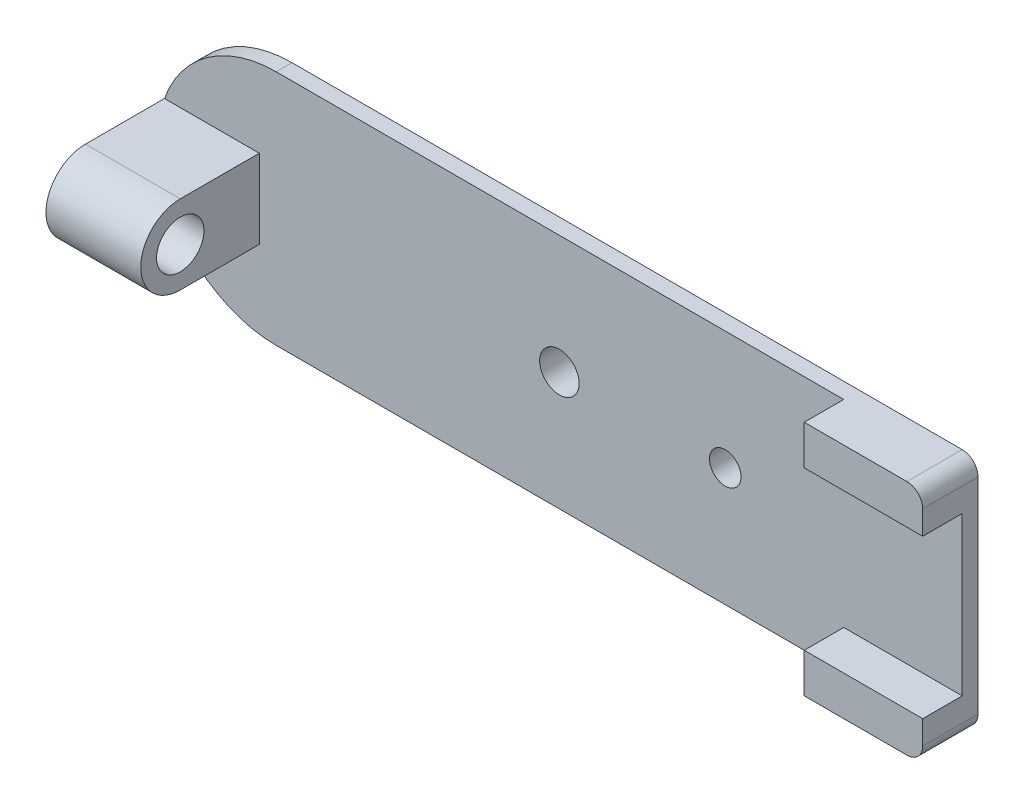
ISO-10303-21;
HEADER;
FILE_DESCRIPTION(('STEP AP214'),'2;1');
FILE_NAME('part.step','',(''),(''),'','','');
FILE_SCHEMA(('AUTOMOTIVE_DESIGN { 1 0 10303 214 1 1 1 1 }'));
ENDSEC;
DATA;
#1=APPLICATION_CONTEXT('core data for automotive mechanical design processes');
#2=APPLICATION_PROTOCOL_DEFINITION('international standard','automotive_design',2000,#1);
#3=PRODUCT_CONTEXT('',#1,'mechanical');
#4=PRODUCT('Part','Part','',(#3));
#5=PRODUCT_RELATED_PRODUCT_CATEGORY('part','',(#4));
#6=PRODUCT_DEFINITION_FORMATION('','',#4);
#7=PRODUCT_DEFINITION_CONTEXT('part definition',#1,'design');
#8=PRODUCT_DEFINITION('design','',#6,#7);
#9=PRODUCT_DEFINITION_SHAPE('','',#8);
#10=(LENGTH_UNIT() NAMED_UNIT(*) SI_UNIT(.MILLI.,.METRE.));
#11=(NAMED_UNIT(*) PLANE_ANGLE_UNIT() SI_UNIT($,.RADIAN.));
#12=(NAMED_UNIT(*) SI_UNIT($,.STERADIAN.) SOLID_ANGLE_UNIT());
#13=UNCERTAINTY_MEASURE_WITH_UNIT(LENGTH_MEASURE(1.E-05),#10,'distance_accuracy_value','');
#14=(GEOMETRIC_REPRESENTATION_CONTEXT(3) GLOBAL_UNCERTAINTY_ASSIGNED_CONTEXT((#13)) GLOBAL_UNIT_ASSIGNED_CONTEXT((#10,
#11,#12)) REPRESENTATION_CONTEXT('',''));
#15=CARTESIAN_POINT('',(0.,0.,0.));
#16=DIRECTION('',(0.,0.,1.));
#17=DIRECTION('',(1.,0.,0.));
#18=AXIS2_PLACEMENT_3D('',#15,#16,#17);
#19=CARTESIAN_POINT('',(0.,0.,0.));
#20=DIRECTION('',(0.,0.,1.));
#21=DIRECTION('',(1.,0.,0.));
#22=AXIS2_PLACEMENT_3D('',#19,#20,#21);
#23=PLANE('',#22);
#24=DIRECTION('',(0.,-1.,0.));
#25=VECTOR('',#24,1.);
#26=CARTESIAN_POINT('',(-28.2842712474619,10.,0.));
#27=LINE('',#26,#25);
#28=CARTESIAN_POINT('',(-28.2842712474619,10.,0.));
#29=VERTEX_POINT('',#28);
#30=CARTESIAN_POINT('',(-28.2842712474619,-9.99999999999999,0.));
#31=VERTEX_POINT('',#30);
#32=EDGE_CURVE('E334',#29,#31,#27,.T.);
#33=ORIENTED_EDGE('',*,*,#32,.F.);
#34=CARTESIAN_POINT('',(0.,0.,0.));
#35=DIRECTION('',(0.,0.,1.));
#36=DIRECTION('',(1.,0.,0.));
#37=AXIS2_PLACEMENT_3D('',#34,#35,#36);
#38=CIRCLE('',#37,30.);
#39=CARTESIAN_POINT('',(0.,30.,0.));
#40=VERTEX_POINT('',#39);
#41=EDGE_CURVE('E378',#40,#29,#38,.T.);
#42=ORIENTED_EDGE('',*,*,#41,.F.);
#43=DIRECTION('',(-1.,0.,0.));
#44=VECTOR('',#43,1.);
#45=CARTESIAN_POINT('',(0.,30.,0.));
#46=LINE('',#45,#44);
#47=CARTESIAN_POINT('',(169.715728752538,30.,0.));
#48=VERTEX_POINT('',#47);
#49=EDGE_CURVE('E332',#48,#40,#46,.T.);
#50=ORIENTED_EDGE('',*,*,#49,.F.);
#51=CARTESIAN_POINT('',(169.715728752538,26.,0.));
#52=DIRECTION('',(0.,0.,1.));
#53=DIRECTION('',(1.,0.,0.));
#54=AXIS2_PLACEMENT_3D('',#51,#52,#53);
#55=CIRCLE('',#54,4.);
#56=CARTESIAN_POINT('',(173.715728752538,26.,0.));
#57=VERTEX_POINT('',#56);
#58=EDGE_CURVE('E294',#48,#57,#55,.F.);
#59=ORIENTED_EDGE('',*,*,#58,.T.);
#60=DIRECTION('',(0.,1.,0.));
#61=VECTOR('',#60,1.);
#62=CARTESIAN_POINT('',(173.715728752538,30.,0.));
#63=LINE('',#62,#61);
#64=CARTESIAN_POINT('',(173.715728752538,-26.,0.));
#65=VERTEX_POINT('',#64);
#66=EDGE_CURVE('E325',#65,#57,#63,.T.);
#67=ORIENTED_EDGE('',*,*,#66,.F.);
#68=CARTESIAN_POINT('',(169.715728752538,-26.,0.));
#69=DIRECTION('',(0.,0.,1.));
#70=DIRECTION('',(1.,0.,0.));
#71=AXIS2_PLACEMENT_3D('',#68,#69,#70);
#72=CIRCLE('',#71,4.);
#73=CARTESIAN_POINT('',(169.715728752538,-30.,0.));
#74=VERTEX_POINT('',#73);
#75=EDGE_CURVE('E292',#65,#74,#72,.F.);
#76=ORIENTED_EDGE('',*,*,#75,.T.);
#77=DIRECTION('',(1.,0.,0.));
#78=VECTOR('',#77,1.);
#79=CARTESIAN_POINT('',(173.715728752538,-30.,0.));
#80=LINE('',#79,#78);
#81=CARTESIAN_POINT('',(0.,-30.,0.));
#82=VERTEX_POINT('',#81);
#83=EDGE_CURVE('E324',#82,#74,#80,.T.);
#84=ORIENTED_EDGE('',*,*,#83,.F.);
#85=CARTESIAN_POINT('',(0.,0.,0.));
#86=DIRECTION('',(0.,0.,1.));
#87=DIRECTION('',(1.,0.,0.));
#88=AXIS2_PLACEMENT_3D('',#85,#86,#87);
#89=CIRCLE('',#88,30.);
#90=EDGE_CURVE('E330',#31,#82,#89,.T.);
#91=ORIENTED_EDGE('',*,*,#90,.F.);
#92=EDGE_LOOP('',(#33,#42,#50,#59,#67,#76,#84,#91));
#93=FACE_BOUND('',#92,.T.);
#94=CARTESIAN_POINT('',(113.715728752538,0.,0.));
#95=DIRECTION('',(0.,0.,1.));
#96=DIRECTION('',(1.,0.,0.));
#97=AXIS2_PLACEMENT_3D('',#94,#95,#96);
#98=CIRCLE('',#97,10.);
#99=CARTESIAN_POINT('',(123.715728752538,0.,0.));
#100=VERTEX_POINT('',#99);
#101=EDGE_CURVE('E280',#100,#100,#98,.T.);
#102=ORIENTED_EDGE('',*,*,#101,.T.);
#103=EDGE_LOOP('',(#102));
#104=FACE_BOUND('',#103,.T.);
#105=CARTESIAN_POINT('',(71.7157287525381,0.,0.));
#106=DIRECTION('',(0.,0.,1.));
#107=DIRECTION('',(1.,0.,0.));
#108=AXIS2_PLACEMENT_3D('',#105,#106,#107);
#109=CIRCLE('',#108,11.);
#110=CARTESIAN_POINT('',(82.7157287525381,0.,0.));
#111=VERTEX_POINT('',#110);
#112=EDGE_CURVE('E276',#111,#111,#109,.T.);
#113=ORIENTED_EDGE('',*,*,#112,.T.);
#114=EDGE_LOOP('',(#113));
#115=FACE_BOUND('',#114,.T.);
#116=ADVANCED_FACE('F35',(#93,#104,#115),#23,.F.);
#117=CARTESIAN_POINT('',(0.,0.,4.));
#118=DIRECTION('',(0.,0.,1.));
#119=DIRECTION('',(1.,0.,0.));
#120=AXIS2_PLACEMENT_3D('',#117,#118,#119);
#121=PLANE('',#120);
#122=DIRECTION('',(-1.,0.,0.));
#123=VECTOR('',#122,1.);
#124=CARTESIAN_POINT('',(0.,10.,4.));
#125=LINE('',#124,#123);
#126=CARTESIAN_POINT('',(-4.2842712474619,10.,4.));
#127=VERTEX_POINT('',#126);
#128=CARTESIAN_POINT('',(-28.2842712474619,10.,4.));
#129=VERTEX_POINT('',#128);
#130=EDGE_CURVE('E50',#127,#129,#125,.T.);
#131=ORIENTED_EDGE('',*,*,#130,.F.);
#132=DIRECTION('',(0.,1.,0.));
#133=VECTOR('',#132,1.);
#134=CARTESIAN_POINT('',(-4.2842712474619,0.,4.));
#135=LINE('',#134,#133);
#136=CARTESIAN_POINT('',(-4.2842712474619,-9.99999999999999,4.));
#137=VERTEX_POINT('',#136);
#138=EDGE_CURVE('E11',#137,#127,#135,.T.);
#139=ORIENTED_EDGE('',*,*,#138,.F.);
#140=DIRECTION('',(1.,0.,0.));
#141=VECTOR('',#140,1.);
#142=CARTESIAN_POINT('',(0.,-9.99999999999999,4.));
#143=LINE('',#142,#141);
#144=CARTESIAN_POINT('',(-28.2842712474619,-9.99999999999999,4.));
#145=VERTEX_POINT('',#144);
#146=EDGE_CURVE('E187',#145,#137,#143,.T.);
#147=ORIENTED_EDGE('',*,*,#146,.F.);
#148=CARTESIAN_POINT('',(0.,0.,4.));
#149=DIRECTION('',(0.,0.,1.));
#150=DIRECTION('',(1.,0.,0.));
#151=AXIS2_PLACEMENT_3D('',#148,#149,#150);
#152=CIRCLE('',#151,30.);
#153=CARTESIAN_POINT('',(0.,-30.,4.));
#154=VERTEX_POINT('',#153);
#155=EDGE_CURVE('E340',#145,#154,#152,.T.);
#156=ORIENTED_EDGE('',*,*,#155,.T.);
#157=DIRECTION('',(1.,0.,0.));
#158=VECTOR('',#157,1.);
#159=CARTESIAN_POINT('',(173.715728752538,-30.,4.));
#160=LINE('',#159,#158);
#161=CARTESIAN_POINT('',(143.715728752538,-30.,4.));
#162=VERTEX_POINT('',#161);
#163=EDGE_CURVE('E257',#154,#162,#160,.T.);
#164=ORIENTED_EDGE('',*,*,#163,.T.);
#165=DIRECTION('',(0.,-1.,0.));
#166=VECTOR('',#165,1.);
#167=CARTESIAN_POINT('',(143.715728752538,-20.,4.));
#168=LINE('',#167,#166);
#169=CARTESIAN_POINT('',(143.715728752538,-20.,4.));
#170=VERTEX_POINT('',#169);
#171=EDGE_CURVE('E203',#170,#162,#168,.T.);
#172=ORIENTED_EDGE('',*,*,#171,.F.);
#173=DIRECTION('',(-1.,0.,0.));
#174=VECTOR('',#173,1.);
#175=CARTESIAN_POINT('',(143.715728752538,-20.,4.));
#176=LINE('',#175,#174);
#177=CARTESIAN_POINT('',(173.715728752538,-20.,4.));
#178=VERTEX_POINT('',#177);
#179=EDGE_CURVE('E206',#178,#170,#176,.T.);
#180=ORIENTED_EDGE('',*,*,#179,.F.);
#181=DIRECTION('',(0.,1.,0.));
#182=VECTOR('',#181,1.);
#183=CARTESIAN_POINT('',(173.715728752538,30.,4.));
#184=LINE('',#183,#182);
#185=CARTESIAN_POINT('',(173.715728752538,20.,4.));
#186=VERTEX_POINT('',#185);
#187=EDGE_CURVE('E254',#178,#186,#184,.T.);
#188=ORIENTED_EDGE('',*,*,#187,.T.);
#189=DIRECTION('',(1.,0.,0.));
#190=VECTOR('',#189,1.);
#191=CARTESIAN_POINT('',(143.715728752538,20.,4.));
#192=LINE('',#191,#190);
#193=CARTESIAN_POINT('',(143.715728752538,20.,4.));
#194=VERTEX_POINT('',#193);
#195=EDGE_CURVE('E231',#194,#186,#192,.T.);
#196=ORIENTED_EDGE('',*,*,#195,.F.);
#197=DIRECTION('',(0.,-1.,0.));
#198=VECTOR('',#197,1.);
#199=CARTESIAN_POINT('',(143.715728752538,30.,4.));
#200=LINE('',#199,#198);
#201=CARTESIAN_POINT('',(143.715728752538,30.,4.));
#202=VERTEX_POINT('',#201);
#203=EDGE_CURVE('E225',#202,#194,#200,.T.);
#204=ORIENTED_EDGE('',*,*,#203,.F.);
#205=DIRECTION('',(-1.,0.,0.));
#206=VECTOR('',#205,1.);
#207=CARTESIAN_POINT('',(0.,30.,4.));
#208=LINE('',#207,#206);
#209=CARTESIAN_POINT('',(0.,30.,4.));
#210=VERTEX_POINT('',#209);
#211=EDGE_CURVE('E235',#202,#210,#208,.T.);
#212=ORIENTED_EDGE('',*,*,#211,.T.);
#213=CARTESIAN_POINT('',(0.,0.,4.));
#214=DIRECTION('',(0.,0.,1.));
#215=DIRECTION('',(1.,0.,0.));
#216=AXIS2_PLACEMENT_3D('',#213,#214,#215);
#217=CIRCLE('',#216,30.);
#218=EDGE_CURVE('E339',#210,#129,#217,.T.);
#219=ORIENTED_EDGE('',*,*,#218,.T.);
#220=EDGE_LOOP('',(#131,#139,#147,#156,#164,#172,#180,#188,#196,#204,#212,#219));
#221=FACE_BOUND('',#220,.T.);
#222=CARTESIAN_POINT('',(71.7157287525381,0.,4.));
#223=DIRECTION('',(0.,0.,1.));
#224=DIRECTION('',(1.,0.,0.));
#225=AXIS2_PLACEMENT_3D('',#222,#223,#224);
#226=CIRCLE('',#225,5.);
#227=CARTESIAN_POINT('',(76.7157287525381,0.,4.));
#228=VERTEX_POINT('',#227);
#229=EDGE_CURVE('E191',#228,#228,#226,.T.);
#230=ORIENTED_EDGE('',*,*,#229,.F.);
#231=EDGE_LOOP('',(#230));
#232=FACE_BOUND('',#231,.T.);
#233=CARTESIAN_POINT('',(113.715728752538,0.,4.));
#234=DIRECTION('',(0.,0.,1.));
#235=DIRECTION('',(1.,0.,0.));
#236=AXIS2_PLACEMENT_3D('',#233,#234,#235);
#237=CIRCLE('',#236,4.00000000000001);
#238=CARTESIAN_POINT('',(117.715728752538,0.,4.));
#239=VERTEX_POINT('',#238);
#240=EDGE_CURVE('E197',#239,#239,#237,.T.);
#241=ORIENTED_EDGE('',*,*,#240,.F.);
#242=EDGE_LOOP('',(#241));
#243=FACE_BOUND('',#242,.T.);
#244=ADVANCED_FACE('F343',(#221,#232,#243),#121,.T.);
#245=CARTESIAN_POINT('',(0.,0.,4.));
#246=DIRECTION('',(0.,0.,-1.));
#247=DIRECTION('',(-1.,0.,0.));
#248=AXIS2_PLACEMENT_3D('',#245,#246,#247);
#249=CYLINDRICAL_SURFACE('',#248,30.);
#250=ORIENTED_EDGE('',*,*,#41,.T.);
#251=DIRECTION('',(0.,0.,-1.));
#252=VECTOR('',#251,1.);
#253=CARTESIAN_POINT('',(-28.2842712474619,10.,4.));
#254=LINE('',#253,#252);
#255=EDGE_CURVE('E271',#129,#29,#254,.T.);
#256=ORIENTED_EDGE('',*,*,#255,.F.);
#257=ORIENTED_EDGE('',*,*,#218,.F.);
#258=DIRECTION('',(0.,0.,-1.));
#259=VECTOR('',#258,1.);
#260=CARTESIAN_POINT('',(0.,30.,4.));
#261=LINE('',#260,#259);
#262=EDGE_CURVE('E265',#210,#40,#261,.T.);
#263=ORIENTED_EDGE('',*,*,#262,.T.);
#264=EDGE_LOOP('',(#250,#256,#257,#263));
#265=FACE_BOUND('',#264,.T.);
#266=ADVANCED_FACE('F37',(#265),#249,.T.);
#267=CARTESIAN_POINT('',(-28.2842712474619,10.,4.));
#268=DIRECTION('',(1.,0.,0.));
#269=DIRECTION('',(0.,0.,-1.));
#270=AXIS2_PLACEMENT_3D('',#267,#268,#269);
#271=PLANE('',#270);
#272=ORIENTED_EDGE('',*,*,#32,.T.);
#273=DIRECTION('',(0.,0.,-1.));
#274=VECTOR('',#273,1.);
#275=CARTESIAN_POINT('',(-28.2842712474619,-9.99999999999999,4.));
#276=LINE('',#275,#274);
#277=EDGE_CURVE('E161',#145,#31,#276,.T.);
#278=ORIENTED_EDGE('',*,*,#277,.F.);
#279=DIRECTION('',(0.,0.,1.));
#280=VECTOR('',#279,1.);
#281=CARTESIAN_POINT('',(-28.2842712474619,-9.99999999999999,0.));
#282=LINE('',#281,#280);
#283=CARTESIAN_POINT('',(-28.2842712474619,-9.99999999999999,24.));
#284=VERTEX_POINT('',#283);
#285=EDGE_CURVE('E152',#145,#284,#282,.T.);
#286=ORIENTED_EDGE('',*,*,#285,.T.);
#287=CARTESIAN_POINT('',(-28.2842712474619,0.,24.));
#288=DIRECTION('',(-1.,0.,0.));
#289=DIRECTION('',(0.,0.,-1.));
#290=AXIS2_PLACEMENT_3D('',#287,#288,#289);
#291=CIRCLE('',#290,10.);
#292=CARTESIAN_POINT('',(-28.2842712474619,10.,24.));
#293=VERTEX_POINT('',#292);
#294=EDGE_CURVE('E158',#284,#293,#291,.T.);
#295=ORIENTED_EDGE('',*,*,#294,.T.);
#296=DIRECTION('',(0.,0.,-1.));
#297=VECTOR('',#296,1.);
#298=CARTESIAN_POINT('',(-28.2842712474619,10.,0.));
#299=LINE('',#298,#297);
#300=EDGE_CURVE('E177',#293,#129,#299,.T.);
#301=ORIENTED_EDGE('',*,*,#300,.T.);
#302=ORIENTED_EDGE('',*,*,#255,.T.);
#303=EDGE_LOOP('',(#272,#278,#286,#295,#301,#302));
#304=FACE_BOUND('',#303,.T.);
#305=CARTESIAN_POINT('',(-28.2842712474619,0.,24.));
#306=DIRECTION('',(-1.,0.,0.));
#307=DIRECTION('',(0.,0.,1.));
#308=AXIS2_PLACEMENT_3D('',#305,#306,#307);
#309=CIRCLE('',#308,6.);
#310=CARTESIAN_POINT('',(-28.2842712474619,0.,30.));
#311=VERTEX_POINT('',#310);
#312=EDGE_CURVE('E699',#311,#311,#309,.T.);
#313=ORIENTED_EDGE('',*,*,#312,.F.);
#314=EDGE_LOOP('',(#313));
#315=FACE_BOUND('',#314,.T.);
#316=ADVANCED_FACE('F154',(#304,#315),#271,.F.);
#317=CARTESIAN_POINT('',(0.,0.,4.));
#318=DIRECTION('',(0.,0.,-1.));
#319=DIRECTION('',(-1.,0.,0.));
#320=AXIS2_PLACEMENT_3D('',#317,#318,#319);
#321=CYLINDRICAL_SURFACE('',#320,30.);
#322=ORIENTED_EDGE('',*,*,#90,.T.);
#323=DIRECTION('',(0.,0.,-1.));
#324=VECTOR('',#323,1.);
#325=CARTESIAN_POINT('',(0.,-30.,4.));
#326=LINE('',#325,#324);
#327=EDGE_CURVE('E268',#154,#82,#326,.T.);
#328=ORIENTED_EDGE('',*,*,#327,.F.);
#329=ORIENTED_EDGE('',*,*,#155,.F.);
#330=ORIENTED_EDGE('',*,*,#277,.T.);
#331=EDGE_LOOP('',(#322,#328,#329,#330));
#332=FACE_BOUND('',#331,.T.);
#333=ADVANCED_FACE('F381',(#332),#321,.T.);
#334=CARTESIAN_POINT('',(173.715728752538,-30.,4.));
#335=DIRECTION('',(0.,1.,0.));
#336=DIRECTION('',(-1.,0.,0.));
#337=AXIS2_PLACEMENT_3D('',#334,#335,#336);
#338=PLANE('',#337);
#339=ORIENTED_EDGE('',*,*,#83,.T.);
#340=DIRECTION('',(0.,0.,-1.));
#341=VECTOR('',#340,1.);
#342=CARTESIAN_POINT('',(169.715728752538,-30.,4.));
#343=LINE('',#342,#341);
#344=CARTESIAN_POINT('',(169.715728752538,-30.,14.));
#345=VERTEX_POINT('',#344);
#346=EDGE_CURVE('E303',#74,#345,#343,.F.);
#347=ORIENTED_EDGE('',*,*,#346,.T.);
#348=DIRECTION('',(1.,0.,0.));
#349=VECTOR('',#348,1.);
#350=CARTESIAN_POINT('',(143.715728752538,-30.,14.));
#351=LINE('',#350,#349);
#352=CARTESIAN_POINT('',(143.715728752538,-30.,14.));
#353=VERTEX_POINT('',#352);
#354=EDGE_CURVE('E211',#353,#345,#351,.T.);
#355=ORIENTED_EDGE('',*,*,#354,.F.);
#356=DIRECTION('',(0.,0.,-1.));
#357=VECTOR('',#356,1.);
#358=CARTESIAN_POINT('',(143.715728752538,-30.,14.));
#359=LINE('',#358,#357);
#360=EDGE_CURVE('E223',#353,#162,#359,.T.);
#361=ORIENTED_EDGE('',*,*,#360,.T.);
#362=ORIENTED_EDGE('',*,*,#163,.F.);
#363=ORIENTED_EDGE('',*,*,#327,.T.);
#364=EDGE_LOOP('',(#339,#347,#355,#361,#362,#363));
#365=FACE_BOUND('',#364,.T.);
#366=ADVANCED_FACE('F327',(#365),#338,.F.);
#367=CARTESIAN_POINT('',(173.715728752538,30.,4.));
#368=DIRECTION('',(-1.,0.,0.));
#369=DIRECTION('',(0.,0.,1.));
#370=AXIS2_PLACEMENT_3D('',#367,#368,#369);
#371=PLANE('',#370);
#372=ORIENTED_EDGE('',*,*,#66,.T.);
#373=DIRECTION('',(0.,0.,-1.));
#374=VECTOR('',#373,1.);
#375=CARTESIAN_POINT('',(173.715728752538,26.,4.));
#376=LINE('',#375,#374);
#377=CARTESIAN_POINT('',(173.715728752538,26.,14.));
#378=VERTEX_POINT('',#377);
#379=EDGE_CURVE('E299',#57,#378,#376,.F.);
#380=ORIENTED_EDGE('',*,*,#379,.T.);
#381=DIRECTION('',(0.,1.,0.));
#382=VECTOR('',#381,1.);
#383=CARTESIAN_POINT('',(173.715728752538,30.,14.));
#384=LINE('',#383,#382);
#385=CARTESIAN_POINT('',(173.715728752538,20.,14.));
#386=VERTEX_POINT('',#385);
#387=EDGE_CURVE('E356',#386,#378,#384,.T.);
#388=ORIENTED_EDGE('',*,*,#387,.F.);
#389=DIRECTION('',(0.,0.,-1.));
#390=VECTOR('',#389,1.);
#391=CARTESIAN_POINT('',(173.715728752538,20.,14.));
#392=LINE('',#391,#390);
#393=EDGE_CURVE('E238',#386,#186,#392,.T.);
#394=ORIENTED_EDGE('',*,*,#393,.T.);
#395=ORIENTED_EDGE('',*,*,#187,.F.);
#396=DIRECTION('',(0.,0.,-1.));
#397=VECTOR('',#396,1.);
#398=CARTESIAN_POINT('',(173.715728752538,-20.,14.));
#399=LINE('',#398,#397);
#400=CARTESIAN_POINT('',(173.715728752538,-20.,14.));
#401=VERTEX_POINT('',#400);
#402=EDGE_CURVE('E221',#401,#178,#399,.T.);
#403=ORIENTED_EDGE('',*,*,#402,.F.);
#404=DIRECTION('',(0.,1.,0.));
#405=VECTOR('',#404,1.);
#406=CARTESIAN_POINT('',(173.715728752538,-20.,14.));
#407=LINE('',#406,#405);
#408=CARTESIAN_POINT('',(173.715728752538,-26.,14.));
#409=VERTEX_POINT('',#408);
#410=EDGE_CURVE('E214',#409,#401,#407,.T.);
#411=ORIENTED_EDGE('',*,*,#410,.F.);
#412=DIRECTION('',(0.,0.,-1.));
#413=VECTOR('',#412,1.);
#414=CARTESIAN_POINT('',(173.715728752538,-26.,4.));
#415=LINE('',#414,#413);
#416=EDGE_CURVE('E296',#409,#65,#415,.T.);
#417=ORIENTED_EDGE('',*,*,#416,.T.);
#418=EDGE_LOOP('',(#372,#380,#388,#394,#395,#403,#411,#417));
#419=FACE_BOUND('',#418,.T.);
#420=ADVANCED_FACE('F314',(#419),#371,.F.);
#421=CARTESIAN_POINT('',(0.,30.,4.));
#422=DIRECTION('',(0.,-1.,0.));
#423=DIRECTION('',(0.,0.,-1.));
#424=AXIS2_PLACEMENT_3D('',#421,#422,#423);
#425=PLANE('',#424);
#426=DIRECTION('',(-1.,0.,0.));
#427=VECTOR('',#426,1.);
#428=CARTESIAN_POINT('',(143.715728752538,30.,14.));
#429=LINE('',#428,#427);
#430=CARTESIAN_POINT('',(169.715728752538,30.,14.));
#431=VERTEX_POINT('',#430);
#432=CARTESIAN_POINT('',(143.715728752538,30.,14.));
#433=VERTEX_POINT('',#432);
#434=EDGE_CURVE('E251',#431,#433,#429,.T.);
#435=ORIENTED_EDGE('',*,*,#434,.F.);
#436=DIRECTION('',(0.,0.,-1.));
#437=VECTOR('',#436,1.);
#438=CARTESIAN_POINT('',(169.715728752538,30.,4.));
#439=LINE('',#438,#437);
#440=EDGE_CURVE('E289',#431,#48,#439,.T.);
#441=ORIENTED_EDGE('',*,*,#440,.T.);
#442=ORIENTED_EDGE('',*,*,#49,.T.);
#443=ORIENTED_EDGE('',*,*,#262,.F.);
#444=ORIENTED_EDGE('',*,*,#211,.F.);
#445=DIRECTION('',(0.,0.,-1.));
#446=VECTOR('',#445,1.);
#447=CARTESIAN_POINT('',(143.715728752538,30.,14.));
#448=LINE('',#447,#446);
#449=EDGE_CURVE('E242',#433,#202,#448,.T.);
#450=ORIENTED_EDGE('',*,*,#449,.F.);
#451=EDGE_LOOP('',(#435,#441,#442,#443,#444,#450));
#452=FACE_BOUND('',#451,.T.);
#453=ADVANCED_FACE('F369',(#452),#425,.F.);
#454=CARTESIAN_POINT('',(143.715728752538,30.,14.));
#455=DIRECTION('',(1.,0.,0.));
#456=DIRECTION('',(0.,0.,-1.));
#457=AXIS2_PLACEMENT_3D('',#454,#455,#456);
#458=PLANE('',#457);
#459=ORIENTED_EDGE('',*,*,#203,.T.);
#460=DIRECTION('',(0.,0.,-1.));
#461=VECTOR('',#460,1.);
#462=CARTESIAN_POINT('',(143.715728752538,20.,14.));
#463=LINE('',#462,#461);
#464=CARTESIAN_POINT('',(143.715728752538,20.,14.));
#465=VERTEX_POINT('',#464);
#466=EDGE_CURVE('E241',#465,#194,#463,.T.);
#467=ORIENTED_EDGE('',*,*,#466,.F.);
#468=DIRECTION('',(0.,-1.,0.));
#469=VECTOR('',#468,1.);
#470=CARTESIAN_POINT('',(143.715728752538,30.,14.));
#471=LINE('',#470,#469);
#472=EDGE_CURVE('E228',#433,#465,#471,.T.);
#473=ORIENTED_EDGE('',*,*,#472,.F.);
#474=ORIENTED_EDGE('',*,*,#449,.T.);
#475=EDGE_LOOP('',(#459,#467,#473,#474));
#476=FACE_BOUND('',#475,.T.);
#477=ADVANCED_FACE('F372',(#476),#458,.F.);
#478=CARTESIAN_POINT('',(143.715728752538,20.,14.));
#479=DIRECTION('',(0.,1.,0.));
#480=DIRECTION('',(0.,0.,1.));
#481=AXIS2_PLACEMENT_3D('',#478,#479,#480);
#482=PLANE('',#481);
#483=ORIENTED_EDGE('',*,*,#195,.T.);
#484=ORIENTED_EDGE('',*,*,#393,.F.);
#485=DIRECTION('',(1.,0.,0.));
#486=VECTOR('',#485,1.);
#487=CARTESIAN_POINT('',(143.715728752538,20.,14.));
#488=LINE('',#487,#486);
#489=EDGE_CURVE('E360',#465,#386,#488,.T.);
#490=ORIENTED_EDGE('',*,*,#489,.F.);
#491=ORIENTED_EDGE('',*,*,#466,.T.);
#492=EDGE_LOOP('',(#483,#484,#490,#491));
#493=FACE_BOUND('',#492,.T.);
#494=ADVANCED_FACE('F358',(#493),#482,.F.);
#495=CARTESIAN_POINT('',(143.715728752538,20.,14.));
#496=DIRECTION('',(0.,0.,1.));
#497=DIRECTION('',(1.,0.,0.));
#498=AXIS2_PLACEMENT_3D('',#495,#496,#497);
#499=PLANE('',#498);
#500=ORIENTED_EDGE('',*,*,#387,.T.);
#501=CARTESIAN_POINT('',(169.715728752538,26.,14.));
#502=DIRECTION('',(0.,0.,1.));
#503=DIRECTION('',(1.,0.,0.));
#504=AXIS2_PLACEMENT_3D('',#501,#502,#503);
#505=CIRCLE('',#504,4.);
#506=EDGE_CURVE('E301',#378,#431,#505,.T.);
#507=ORIENTED_EDGE('',*,*,#506,.T.);
#508=ORIENTED_EDGE('',*,*,#434,.T.);
#509=ORIENTED_EDGE('',*,*,#472,.T.);
#510=ORIENTED_EDGE('',*,*,#489,.T.);
#511=EDGE_LOOP('',(#500,#507,#508,#509,#510));
#512=FACE_BOUND('',#511,.T.);
#513=ADVANCED_FACE('F420',(#512),#499,.T.);
#514=CARTESIAN_POINT('',(143.715728752538,-20.,14.));
#515=DIRECTION('',(1.,0.,0.));
#516=DIRECTION('',(0.,0.,-1.));
#517=AXIS2_PLACEMENT_3D('',#514,#515,#516);
#518=PLANE('',#517);
#519=ORIENTED_EDGE('',*,*,#171,.T.);
#520=ORIENTED_EDGE('',*,*,#360,.F.);
#521=DIRECTION('',(0.,-1.,0.));
#522=VECTOR('',#521,1.);
#523=CARTESIAN_POINT('',(143.715728752538,-20.,14.));
#524=LINE('',#523,#522);
#525=CARTESIAN_POINT('',(143.715728752538,-20.,14.));
#526=VERTEX_POINT('',#525);
#527=EDGE_CURVE('E208',#526,#353,#524,.T.);
#528=ORIENTED_EDGE('',*,*,#527,.F.);
#529=DIRECTION('',(0.,0.,-1.));
#530=VECTOR('',#529,1.);
#531=CARTESIAN_POINT('',(143.715728752538,-20.,14.));
#532=LINE('',#531,#530);
#533=EDGE_CURVE('E218',#526,#170,#532,.T.);
#534=ORIENTED_EDGE('',*,*,#533,.T.);
#535=EDGE_LOOP('',(#519,#520,#528,#534));
#536=FACE_BOUND('',#535,.T.);
#537=ADVANCED_FACE('F349',(#536),#518,.F.);
#538=CARTESIAN_POINT('',(143.715728752538,-20.,14.));
#539=DIRECTION('',(0.,-1.,0.));
#540=DIRECTION('',(0.,0.,-1.));
#541=AXIS2_PLACEMENT_3D('',#538,#539,#540);
#542=PLANE('',#541);
#543=ORIENTED_EDGE('',*,*,#179,.T.);
#544=ORIENTED_EDGE('',*,*,#533,.F.);
#545=DIRECTION('',(-1.,0.,0.));
#546=VECTOR('',#545,1.);
#547=CARTESIAN_POINT('',(143.715728752538,-20.,14.));
#548=LINE('',#547,#546);
#549=EDGE_CURVE('E216',#401,#526,#548,.T.);
#550=ORIENTED_EDGE('',*,*,#549,.F.);
#551=ORIENTED_EDGE('',*,*,#402,.T.);
#552=EDGE_LOOP('',(#543,#544,#550,#551));
#553=FACE_BOUND('',#552,.T.);
#554=ADVANCED_FACE('F352',(#553),#542,.F.);
#555=CARTESIAN_POINT('',(143.715728752538,-30.,14.));
#556=DIRECTION('',(0.,0.,1.));
#557=DIRECTION('',(1.,0.,0.));
#558=AXIS2_PLACEMENT_3D('',#555,#556,#557);
#559=PLANE('',#558);
#560=ORIENTED_EDGE('',*,*,#354,.T.);
#561=CARTESIAN_POINT('',(169.715728752538,-26.,14.));
#562=DIRECTION('',(0.,0.,1.));
#563=DIRECTION('',(1.,0.,0.));
#564=AXIS2_PLACEMENT_3D('',#561,#562,#563);
#565=CIRCLE('',#564,4.);
#566=EDGE_CURVE('E43',#345,#409,#565,.T.);
#567=ORIENTED_EDGE('',*,*,#566,.T.);
#568=ORIENTED_EDGE('',*,*,#410,.T.);
#569=ORIENTED_EDGE('',*,*,#549,.T.);
#570=ORIENTED_EDGE('',*,*,#527,.T.);
#571=EDGE_LOOP('',(#560,#567,#568,#569,#570));
#572=FACE_BOUND('',#571,.T.);
#573=ADVANCED_FACE('F307',(#572),#559,.T.);
#574=CARTESIAN_POINT('',(113.715728752538,0.,-4.));
#575=DIRECTION('',(0.,0.,1.));
#576=DIRECTION('',(1.,0.,0.));
#577=AXIS2_PLACEMENT_3D('',#574,#575,#576);
#578=CYLINDRICAL_SURFACE('',#577,8.00000000000001);
#579=CARTESIAN_POINT('',(113.715728752538,0.,-2.));
#580=DIRECTION('',(0.,0.,1.));
#581=DIRECTION('',(1.,0.,0.));
#582=AXIS2_PLACEMENT_3D('',#579,#580,#581);
#583=CIRCLE('',#582,8.00000000000001);
#584=CARTESIAN_POINT('',(121.715728752538,0.,-2.));
#585=VERTEX_POINT('',#584);
#586=EDGE_CURVE('E258',#585,#585,#583,.F.);
#587=ORIENTED_EDGE('',*,*,#586,.T.);
#588=EDGE_LOOP('',(#587));
#589=FACE_BOUND('',#588,.T.);
#590=CARTESIAN_POINT('',(113.715728752538,0.,-4.));
#591=DIRECTION('',(0.,0.,-1.));
#592=DIRECTION('',(-1.,0.,0.));
#593=AXIS2_PLACEMENT_3D('',#590,#591,#592);
#594=CIRCLE('',#593,8.00000000000001);
#595=CARTESIAN_POINT('',(105.715728752538,0.,-4.));
#596=VERTEX_POINT('',#595);
#597=EDGE_CURVE('E200',#596,#596,#594,.T.);
#598=ORIENTED_EDGE('',*,*,#597,.F.);
#599=EDGE_LOOP('',(#598));
#600=FACE_BOUND('',#599,.T.);
#601=ADVANCED_FACE('F444',(#589,#600),#578,.T.);
#602=CARTESIAN_POINT('',(113.715728752538,0.,-4.));
#603=DIRECTION('',(0.,0.,-1.));
#604=DIRECTION('',(-1.,0.,0.));
#605=AXIS2_PLACEMENT_3D('',#602,#603,#604);
#606=PLANE('',#605);
#607=CARTESIAN_POINT('',(113.715728752538,0.,-4.));
#608=DIRECTION('',(0.,0.,-1.));
#609=DIRECTION('',(-1.,0.,0.));
#610=AXIS2_PLACEMENT_3D('',#607,#608,#609);
#611=CIRCLE('',#610,4.00000000000001);
#612=CARTESIAN_POINT('',(109.715728752538,0.,-4.));
#613=VERTEX_POINT('',#612);
#614=EDGE_CURVE('E194',#613,#613,#611,.T.);
#615=ORIENTED_EDGE('',*,*,#614,.F.);
#616=EDGE_LOOP('',(#615));
#617=FACE_BOUND('',#616,.T.);
#618=ORIENTED_EDGE('',*,*,#597,.T.);
#619=EDGE_LOOP('',(#618));
#620=FACE_BOUND('',#619,.T.);
#621=ADVANCED_FACE('F452',(#617,#620),#606,.T.);
#622=CARTESIAN_POINT('',(71.7157287525381,0.,-4.));
#623=DIRECTION('',(0.,0.,1.));
#624=DIRECTION('',(1.,0.,0.));
#625=AXIS2_PLACEMENT_3D('',#622,#623,#624);
#626=CYLINDRICAL_SURFACE('',#625,9.00000000000001);
#627=CARTESIAN_POINT('',(71.7157287525381,0.,-2.));
#628=DIRECTION('',(0.,0.,1.));
#629=DIRECTION('',(1.,0.,0.));
#630=AXIS2_PLACEMENT_3D('',#627,#628,#629);
#631=CIRCLE('',#630,9.00000000000001);
#632=CARTESIAN_POINT('',(80.7157287525381,0.,-2.));
#633=VERTEX_POINT('',#632);
#634=EDGE_CURVE('E284',#633,#633,#631,.F.);
#635=ORIENTED_EDGE('',*,*,#634,.T.);
#636=EDGE_LOOP('',(#635));
#637=FACE_BOUND('',#636,.T.);
#638=CARTESIAN_POINT('',(71.7157287525381,0.,-14.));
#639=DIRECTION('',(0.,0.,-1.));
#640=DIRECTION('',(-1.,0.,0.));
#641=AXIS2_PLACEMENT_3D('',#638,#639,#640);
#642=CIRCLE('',#641,9.);
#643=CARTESIAN_POINT('',(62.7157287525381,0.,-14.));
#644=VERTEX_POINT('',#643);
#645=EDGE_CURVE('E693',#644,#644,#642,.T.);
#646=ORIENTED_EDGE('',*,*,#645,.F.);
#647=EDGE_LOOP('',(#646));
#648=FACE_BOUND('',#647,.T.);
#649=ADVANCED_FACE('F461',(#637,#648),#626,.T.);
#650=CARTESIAN_POINT('',(113.715728752538,0.,14.000025));
#651=DIRECTION('',(0.,0.,-1.));
#652=DIRECTION('',(-1.,0.,0.));
#653=AXIS2_PLACEMENT_3D('',#650,#651,#652);
#654=CYLINDRICAL_SURFACE('',#653,4.00000000000001);
#655=ORIENTED_EDGE('',*,*,#240,.T.);
#656=EDGE_LOOP('',(#655));
#657=FACE_BOUND('',#656,.T.);
#658=ORIENTED_EDGE('',*,*,#614,.T.);
#659=EDGE_LOOP('',(#658));
#660=FACE_BOUND('',#659,.T.);
#661=ADVANCED_FACE('F470',(#657,#660),#654,.F.);
#662=CARTESIAN_POINT('',(71.7157287525381,0.,14.000025));
#663=DIRECTION('',(0.,0.,-1.));
#664=DIRECTION('',(-1.,0.,0.));
#665=AXIS2_PLACEMENT_3D('',#662,#663,#664);
#666=CYLINDRICAL_SURFACE('',#665,5.);
#667=ORIENTED_EDGE('',*,*,#229,.T.);
#668=EDGE_LOOP('',(#667));
#669=FACE_BOUND('',#668,.T.);
#670=CARTESIAN_POINT('',(71.7157287525381,0.,-14.));
#671=DIRECTION('',(0.,0.,-1.));
#672=DIRECTION('',(-1.,0.,0.));
#673=AXIS2_PLACEMENT_3D('',#670,#671,#672);
#674=CIRCLE('',#673,5.);
#675=CARTESIAN_POINT('',(66.7157287525381,0.,-14.));
#676=VERTEX_POINT('',#675);
#677=EDGE_CURVE('E696',#676,#676,#674,.T.);
#678=ORIENTED_EDGE('',*,*,#677,.T.);
#679=EDGE_LOOP('',(#678));
#680=FACE_BOUND('',#679,.T.);
#681=ADVANCED_FACE('F479',(#669,#680),#666,.F.);
#682=CARTESIAN_POINT('',(113.715728752538,0.,-2.));
#683=DIRECTION('',(0.,0.,1.));
#684=DIRECTION('',(1.,0.,0.));
#685=AXIS2_PLACEMENT_3D('',#682,#683,#684);
#686=TOROIDAL_SURFACE('',#685,10.,2.);
#687=ORIENTED_EDGE('',*,*,#101,.F.);
#688=EDGE_LOOP('',(#687));
#689=FACE_BOUND('',#688,.T.);
#690=ORIENTED_EDGE('',*,*,#586,.F.);
#691=EDGE_LOOP('',(#690));
#692=FACE_BOUND('',#691,.T.);
#693=ADVANCED_FACE('F487',(#689,#692),#686,.F.);
#694=CARTESIAN_POINT('',(71.7157287525381,0.,-2.));
#695=DIRECTION('',(0.,0.,1.));
#696=DIRECTION('',(1.,0.,0.));
#697=AXIS2_PLACEMENT_3D('',#694,#695,#696);
#698=TOROIDAL_SURFACE('',#697,11.,2.);
#699=ORIENTED_EDGE('',*,*,#112,.F.);
#700=EDGE_LOOP('',(#699));
#701=FACE_BOUND('',#700,.T.);
#702=ORIENTED_EDGE('',*,*,#634,.F.);
#703=EDGE_LOOP('',(#702));
#704=FACE_BOUND('',#703,.T.);
#705=ADVANCED_FACE('F495',(#701,#704),#698,.F.);
#706=CARTESIAN_POINT('',(169.715728752538,26.,4.));
#707=DIRECTION('',(0.,0.,-1.));
#708=DIRECTION('',(-1.,0.,0.));
#709=AXIS2_PLACEMENT_3D('',#706,#707,#708);
#710=CYLINDRICAL_SURFACE('',#709,4.);
#711=ORIENTED_EDGE('',*,*,#506,.F.);
#712=ORIENTED_EDGE('',*,*,#379,.F.);
#713=ORIENTED_EDGE('',*,*,#58,.F.);
#714=ORIENTED_EDGE('',*,*,#440,.F.);
#715=EDGE_LOOP('',(#711,#712,#713,#714));
#716=FACE_BOUND('',#715,.T.);
#717=ADVANCED_FACE('F503',(#716),#710,.T.);
#718=CARTESIAN_POINT('',(169.715728752538,-26.,4.));
#719=DIRECTION('',(0.,0.,-1.));
#720=DIRECTION('',(-1.,0.,0.));
#721=AXIS2_PLACEMENT_3D('',#718,#719,#720);
#722=CYLINDRICAL_SURFACE('',#721,4.);
#723=ORIENTED_EDGE('',*,*,#566,.F.);
#724=ORIENTED_EDGE('',*,*,#346,.F.);
#725=ORIENTED_EDGE('',*,*,#75,.F.);
#726=ORIENTED_EDGE('',*,*,#416,.F.);
#727=EDGE_LOOP('',(#723,#724,#725,#726));
#728=FACE_BOUND('',#727,.T.);
#729=ADVANCED_FACE('F318',(#728),#722,.T.);
#730=CARTESIAN_POINT('',(-4.2842712474619,10.,0.));
#731=DIRECTION('',(0.,1.,0.));
#732=DIRECTION('',(0.,0.,1.));
#733=AXIS2_PLACEMENT_3D('',#730,#731,#732);
#734=PLANE('',#733);
#735=DIRECTION('',(0.,0.,-1.));
#736=VECTOR('',#735,1.);
#737=CARTESIAN_POINT('',(-4.2842712474619,10.,0.));
#738=LINE('',#737,#736);
#739=CARTESIAN_POINT('',(-4.2842712474619,10.,24.));
#740=VERTEX_POINT('',#739);
#741=EDGE_CURVE('E174',#740,#127,#738,.T.);
#742=ORIENTED_EDGE('',*,*,#741,.T.);
#743=ORIENTED_EDGE('',*,*,#130,.T.);
#744=ORIENTED_EDGE('',*,*,#300,.F.);
#745=DIRECTION('',(-1.,0.,0.));
#746=VECTOR('',#745,1.);
#747=CARTESIAN_POINT('',(-4.2842712474619,10.,24.));
#748=LINE('',#747,#746);
#749=EDGE_CURVE('E173',#740,#293,#748,.T.);
#750=ORIENTED_EDGE('',*,*,#749,.F.);
#751=EDGE_LOOP('',(#742,#743,#744,#750));
#752=FACE_BOUND('',#751,.T.);
#753=ADVANCED_FACE('F518',(#752),#734,.T.);
#754=CARTESIAN_POINT('',(-4.2842712474619,0.,24.));
#755=DIRECTION('',(-1.,0.,0.));
#756=DIRECTION('',(0.,0.,1.));
#757=AXIS2_PLACEMENT_3D('',#754,#755,#756);
#758=CYLINDRICAL_SURFACE('',#757,10.);
#759=ORIENTED_EDGE('',*,*,#294,.F.);
#760=DIRECTION('',(-1.,0.,0.));
#761=VECTOR('',#760,1.);
#762=CARTESIAN_POINT('',(-4.2842712474619,-9.99999999999999,24.));
#763=LINE('',#762,#761);
#764=CARTESIAN_POINT('',(-4.2842712474619,-9.99999999999999,24.));
#765=VERTEX_POINT('',#764);
#766=EDGE_CURVE('E166',#765,#284,#763,.T.);
#767=ORIENTED_EDGE('',*,*,#766,.F.);
#768=CARTESIAN_POINT('',(-4.2842712474619,0.,24.));
#769=DIRECTION('',(-1.,0.,0.));
#770=DIRECTION('',(0.,0.,-1.));
#771=AXIS2_PLACEMENT_3D('',#768,#769,#770);
#772=CIRCLE('',#771,10.);
#773=EDGE_CURVE('E183',#765,#740,#772,.T.);
#774=ORIENTED_EDGE('',*,*,#773,.T.);
#775=ORIENTED_EDGE('',*,*,#749,.T.);
#776=EDGE_LOOP('',(#759,#767,#774,#775));
#777=FACE_BOUND('',#776,.T.);
#778=ADVANCED_FACE('F176',(#777),#758,.T.);
#779=CARTESIAN_POINT('',(-4.2842712474619,-9.99999999999999,0.));
#780=DIRECTION('',(0.,-1.,0.));
#781=DIRECTION('',(0.,0.,-1.));
#782=AXIS2_PLACEMENT_3D('',#779,#780,#781);
#783=PLANE('',#782);
#784=ORIENTED_EDGE('',*,*,#285,.F.);
#785=ORIENTED_EDGE('',*,*,#146,.T.);
#786=DIRECTION('',(0.,0.,1.));
#787=VECTOR('',#786,1.);
#788=CARTESIAN_POINT('',(-4.2842712474619,-9.99999999999999,0.));
#789=LINE('',#788,#787);
#790=EDGE_CURVE('E169',#137,#765,#789,.T.);
#791=ORIENTED_EDGE('',*,*,#790,.T.);
#792=ORIENTED_EDGE('',*,*,#766,.T.);
#793=EDGE_LOOP('',(#784,#785,#791,#792));
#794=FACE_BOUND('',#793,.T.);
#795=ADVANCED_FACE('F167',(#794),#783,.T.);
#796=CARTESIAN_POINT('',(-4.2842712474619,0.,24.));
#797=DIRECTION('',(1.,0.,0.));
#798=DIRECTION('',(0.,0.,-1.));
#799=AXIS2_PLACEMENT_3D('',#796,#797,#798);
#800=PLANE('',#799);
#801=CARTESIAN_POINT('',(-4.2842712474619,0.,24.));
#802=DIRECTION('',(-1.,0.,0.));
#803=DIRECTION('',(0.,0.,1.));
#804=AXIS2_PLACEMENT_3D('',#801,#802,#803);
#805=CIRCLE('',#804,6.);
#806=CARTESIAN_POINT('',(-4.2842712474619,0.,30.));
#807=VERTEX_POINT('',#806);
#808=EDGE_CURVE('E163',#807,#807,#805,.T.);
#809=ORIENTED_EDGE('',*,*,#808,.T.);
#810=EDGE_LOOP('',(#809));
#811=FACE_BOUND('',#810,.T.);
#812=ORIENTED_EDGE('',*,*,#790,.F.);
#813=ORIENTED_EDGE('',*,*,#138,.T.);
#814=ORIENTED_EDGE('',*,*,#741,.F.);
#815=ORIENTED_EDGE('',*,*,#773,.F.);
#816=EDGE_LOOP('',(#812,#813,#814,#815));
#817=FACE_BOUND('',#816,.T.);
#818=ADVANCED_FACE('F539',(#811,#817),#800,.T.);
#819=CARTESIAN_POINT('',(-4.2842712474619,0.,24.));
#820=DIRECTION('',(-1.,0.,0.));
#821=DIRECTION('',(0.,0.,1.));
#822=AXIS2_PLACEMENT_3D('',#819,#820,#821);
#823=CYLINDRICAL_SURFACE('',#822,6.);
#824=ORIENTED_EDGE('',*,*,#808,.F.);
#825=EDGE_LOOP('',(#824));
#826=FACE_BOUND('',#825,.T.);
#827=ORIENTED_EDGE('',*,*,#312,.T.);
#828=EDGE_LOOP('',(#827));
#829=FACE_BOUND('',#828,.T.);
#830=ADVANCED_FACE('F546',(#826,#829),#823,.F.);
#831=CARTESIAN_POINT('',(71.7157287525381,0.,-14.));
#832=DIRECTION('',(0.,0.,-1.));
#833=DIRECTION('',(-1.,0.,0.));
#834=AXIS2_PLACEMENT_3D('',#831,#832,#833);
#835=PLANE('',#834);
#836=ORIENTED_EDGE('',*,*,#645,.T.);
#837=EDGE_LOOP('',(#836));
#838=FACE_BOUND('',#837,.T.);
#839=ORIENTED_EDGE('',*,*,#677,.F.);
#840=EDGE_LOOP('',(#839));
#841=FACE_BOUND('',#840,.T.);
#842=ADVANCED_FACE('F555',(#838,#841),#835,.T.);
#843=CLOSED_SHELL('',(#116,#244,#266,#316,#333,#366,#420,#453,#477,#494,#513,#537,#554,#573,
#601,#621,#649,#661,#681,#693,#705,#717,#729,#753,#778,#795,#818,#830,#842));
#844=MANIFOLD_SOLID_BREP('B2',#843);
#845=ADVANCED_BREP_SHAPE_REPRESENTATION('',(#18,#844),#14);
#846=SHAPE_DEFINITION_REPRESENTATION(#9,#845);
ENDSEC;
END-ISO-10303-21;
